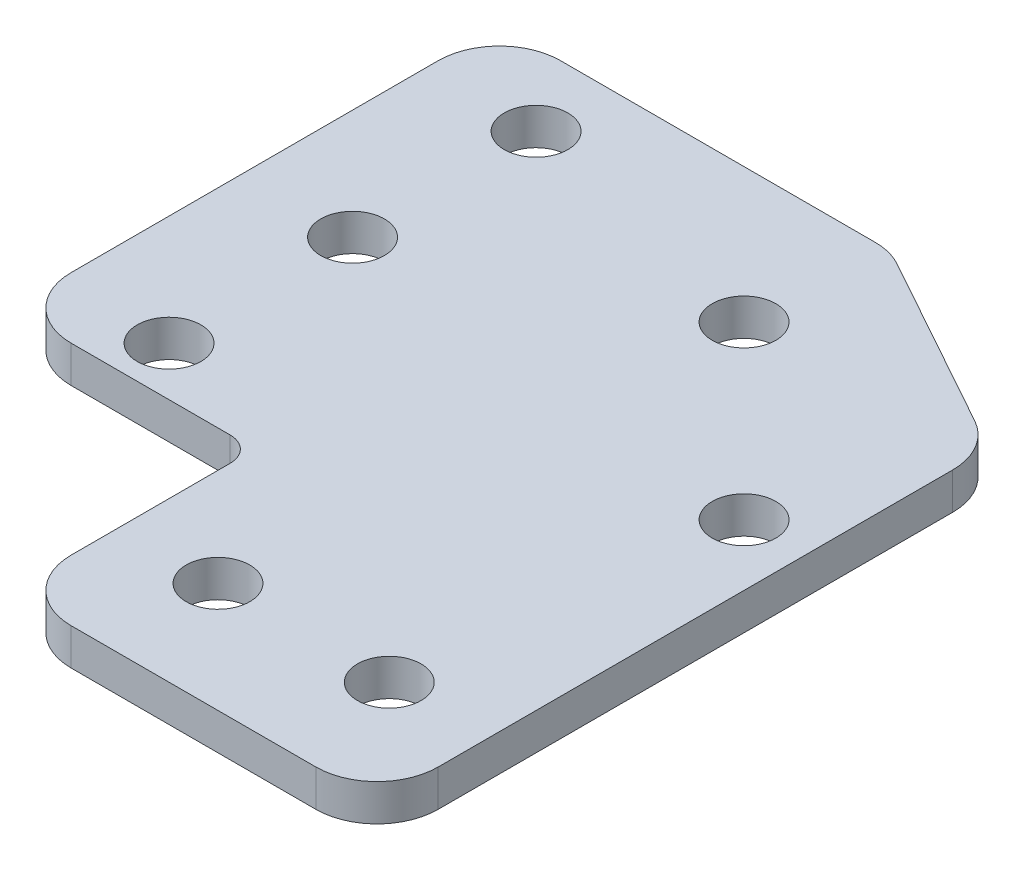
ISO-10303-21;
HEADER;
FILE_DESCRIPTION(('STEP AP214'),'2;1');
FILE_NAME('part.step','',(''),(''),'','','');
FILE_SCHEMA(('AUTOMOTIVE_DESIGN { 1 0 10303 214 1 1 1 1 }'));
ENDSEC;
DATA;
#1=APPLICATION_CONTEXT('core data for automotive mechanical design processes');
#2=APPLICATION_PROTOCOL_DEFINITION('international standard','automotive_design',2000,#1);
#3=PRODUCT_CONTEXT('',#1,'mechanical');
#4=PRODUCT('Part','Part','',(#3));
#5=PRODUCT_RELATED_PRODUCT_CATEGORY('part','',(#4));
#6=PRODUCT_DEFINITION_FORMATION('','',#4);
#7=PRODUCT_DEFINITION_CONTEXT('part definition',#1,'design');
#8=PRODUCT_DEFINITION('design','',#6,#7);
#9=PRODUCT_DEFINITION_SHAPE('','',#8);
#10=(LENGTH_UNIT() NAMED_UNIT(*) SI_UNIT(.MILLI.,.METRE.));
#11=(NAMED_UNIT(*) PLANE_ANGLE_UNIT() SI_UNIT($,.RADIAN.));
#12=(NAMED_UNIT(*) SI_UNIT($,.STERADIAN.) SOLID_ANGLE_UNIT());
#13=UNCERTAINTY_MEASURE_WITH_UNIT(LENGTH_MEASURE(1.E-05),#10,'distance_accuracy_value','');
#14=(GEOMETRIC_REPRESENTATION_CONTEXT(3) GLOBAL_UNCERTAINTY_ASSIGNED_CONTEXT((#13)) GLOBAL_UNIT_ASSIGNED_CONTEXT((#10,
#11,#12)) REPRESENTATION_CONTEXT('',''));
#15=CARTESIAN_POINT('',(0.,0.,0.));
#16=DIRECTION('',(0.,0.,1.));
#17=DIRECTION('',(1.,0.,0.));
#18=AXIS2_PLACEMENT_3D('',#15,#16,#17);
#19=CARTESIAN_POINT('',(20.,-3.,0.));
#20=DIRECTION('',(-1.,0.,0.));
#21=DIRECTION('',(0.,0.,1.));
#22=AXIS2_PLACEMENT_3D('',#19,#20,#21);
#23=PLANE('',#22);
#24=DIRECTION('',(0.,0.,1.));
#25=VECTOR('',#24,1.);
#26=CARTESIAN_POINT('',(20.,0.,0.));
#27=LINE('',#26,#25);
#28=CARTESIAN_POINT('',(20.,0.,-18.));
#29=VERTEX_POINT('',#28);
#30=CARTESIAN_POINT('',(20.,0.,-5.));
#31=VERTEX_POINT('',#30);
#32=EDGE_CURVE('E136',#29,#31,#27,.T.);
#33=ORIENTED_EDGE('',*,*,#32,.F.);
#34=DIRECTION('',(0.,1.,0.));
#35=VECTOR('',#34,1.);
#36=CARTESIAN_POINT('',(20.,-3.,-18.));
#37=LINE('',#36,#35);
#38=CARTESIAN_POINT('',(20.,-3.,-18.));
#39=VERTEX_POINT('',#38);
#40=EDGE_CURVE('E61',#29,#39,#37,.F.);
#41=ORIENTED_EDGE('',*,*,#40,.T.);
#42=DIRECTION('',(0.,0.,1.));
#43=VECTOR('',#42,1.);
#44=CARTESIAN_POINT('',(20.,-3.,0.));
#45=LINE('',#44,#43);
#46=CARTESIAN_POINT('',(20.,-3.,-5.));
#47=VERTEX_POINT('',#46);
#48=EDGE_CURVE('E156',#39,#47,#45,.T.);
#49=ORIENTED_EDGE('',*,*,#48,.T.);
#50=DIRECTION('',(0.,1.,0.));
#51=VECTOR('',#50,1.);
#52=CARTESIAN_POINT('',(20.,-3.,-5.));
#53=LINE('',#52,#51);
#54=EDGE_CURVE('E151',#47,#31,#53,.T.);
#55=ORIENTED_EDGE('',*,*,#54,.T.);
#56=EDGE_LOOP('',(#33,#41,#49,#55));
#57=FACE_BOUND('',#56,.T.);
#58=ADVANCED_FACE('F40',(#57),#23,.T.);
#59=CARTESIAN_POINT('',(20.,-3.,-20.));
#60=DIRECTION('',(0.,0.,1.));
#61=DIRECTION('',(1.,0.,0.));
#62=AXIS2_PLACEMENT_3D('',#59,#60,#61);
#63=PLANE('',#62);
#64=DIRECTION('',(1.,0.,0.));
#65=VECTOR('',#64,1.);
#66=CARTESIAN_POINT('',(20.,-3.,-20.));
#67=LINE('',#66,#65);
#68=CARTESIAN_POINT('',(5.,-3.,-20.));
#69=VERTEX_POINT('',#68);
#70=CARTESIAN_POINT('',(18.,-3.,-20.));
#71=VERTEX_POINT('',#70);
#72=EDGE_CURVE('E159',#69,#71,#67,.T.);
#73=ORIENTED_EDGE('',*,*,#72,.T.);
#74=DIRECTION('',(0.,1.,0.));
#75=VECTOR('',#74,1.);
#76=CARTESIAN_POINT('',(18.,0.,-20.));
#77=LINE('',#76,#75);
#78=CARTESIAN_POINT('',(18.,0.,-20.));
#79=VERTEX_POINT('',#78);
#80=EDGE_CURVE('E213',#71,#79,#77,.T.);
#81=ORIENTED_EDGE('',*,*,#80,.T.);
#82=DIRECTION('',(1.,0.,0.));
#83=VECTOR('',#82,1.);
#84=CARTESIAN_POINT('',(20.,0.,-20.));
#85=LINE('',#84,#83);
#86=CARTESIAN_POINT('',(5.,0.,-20.));
#87=VERTEX_POINT('',#86);
#88=EDGE_CURVE('E167',#87,#79,#85,.T.);
#89=ORIENTED_EDGE('',*,*,#88,.F.);
#90=DIRECTION('',(0.,1.,0.));
#91=VECTOR('',#90,1.);
#92=CARTESIAN_POINT('',(5.,-3.,-20.));
#93=LINE('',#92,#91);
#94=EDGE_CURVE('E196',#87,#69,#93,.F.);
#95=ORIENTED_EDGE('',*,*,#94,.T.);
#96=EDGE_LOOP('',(#73,#81,#89,#95));
#97=FACE_BOUND('',#96,.T.);
#98=ADVANCED_FACE('F219',(#97),#63,.T.);
#99=CARTESIAN_POINT('',(0.,-3.,-20.));
#100=DIRECTION('',(-1.,0.,0.));
#101=DIRECTION('',(0.,0.,1.));
#102=AXIS2_PLACEMENT_3D('',#99,#100,#101);
#103=PLANE('',#102);
#104=DIRECTION('',(0.,0.,1.));
#105=VECTOR('',#104,1.);
#106=CARTESIAN_POINT('',(0.,-3.,-20.));
#107=LINE('',#106,#105);
#108=CARTESIAN_POINT('',(0.,-3.,-55.));
#109=VERTEX_POINT('',#108);
#110=CARTESIAN_POINT('',(0.,-3.,-25.));
#111=VERTEX_POINT('',#110);
#112=EDGE_CURVE('E164',#109,#111,#107,.T.);
#113=ORIENTED_EDGE('',*,*,#112,.T.);
#114=DIRECTION('',(0.,1.,0.));
#115=VECTOR('',#114,1.);
#116=CARTESIAN_POINT('',(0.,-3.,-25.));
#117=LINE('',#116,#115);
#118=CARTESIAN_POINT('',(0.,0.,-25.));
#119=VERTEX_POINT('',#118);
#120=EDGE_CURVE('E193',#111,#119,#117,.T.);
#121=ORIENTED_EDGE('',*,*,#120,.T.);
#122=DIRECTION('',(0.,0.,1.));
#123=VECTOR('',#122,1.);
#124=CARTESIAN_POINT('',(0.,0.,-20.));
#125=LINE('',#124,#123);
#126=CARTESIAN_POINT('',(0.,0.,-55.));
#127=VERTEX_POINT('',#126);
#128=EDGE_CURVE('E225',#127,#119,#125,.T.);
#129=ORIENTED_EDGE('',*,*,#128,.F.);
#130=DIRECTION('',(0.,1.,0.));
#131=VECTOR('',#130,1.);
#132=CARTESIAN_POINT('',(0.,-3.,-55.));
#133=LINE('',#132,#131);
#134=EDGE_CURVE('E191',#127,#109,#133,.F.);
#135=ORIENTED_EDGE('',*,*,#134,.T.);
#136=EDGE_LOOP('',(#113,#121,#129,#135));
#137=FACE_BOUND('',#136,.T.);
#138=ADVANCED_FACE('F332',(#137),#103,.T.);
#139=CARTESIAN_POINT('',(0.,-3.,-60.));
#140=DIRECTION('',(0.,0.,-1.));
#141=DIRECTION('',(-1.,0.,0.));
#142=AXIS2_PLACEMENT_3D('',#139,#140,#141);
#143=PLANE('',#142);
#144=DIRECTION('',(-1.,0.,0.));
#145=VECTOR('',#144,1.);
#146=CARTESIAN_POINT('',(0.,-3.,-60.));
#147=LINE('',#146,#145);
#148=CARTESIAN_POINT('',(30.704369859013,-3.,-60.));
#149=VERTEX_POINT('',#148);
#150=CARTESIAN_POINT('',(5.,-3.,-60.));
#151=VERTEX_POINT('',#150);
#152=EDGE_CURVE('E242',#149,#151,#147,.T.);
#153=ORIENTED_EDGE('',*,*,#152,.T.);
#154=DIRECTION('',(0.,1.,0.));
#155=VECTOR('',#154,1.);
#156=CARTESIAN_POINT('',(5.,-3.,-60.));
#157=LINE('',#156,#155);
#158=CARTESIAN_POINT('',(5.,0.,-60.));
#159=VERTEX_POINT('',#158);
#160=EDGE_CURVE('E200',#151,#159,#157,.T.);
#161=ORIENTED_EDGE('',*,*,#160,.T.);
#162=DIRECTION('',(-1.,0.,0.));
#163=VECTOR('',#162,1.);
#164=CARTESIAN_POINT('',(0.,0.,-60.));
#165=LINE('',#164,#163);
#166=CARTESIAN_POINT('',(30.704369859013,0.,-60.));
#167=VERTEX_POINT('',#166);
#168=EDGE_CURVE('E228',#167,#159,#165,.T.);
#169=ORIENTED_EDGE('',*,*,#168,.F.);
#170=DIRECTION('',(0.,1.,0.));
#171=VECTOR('',#170,1.);
#172=CARTESIAN_POINT('',(30.704369859013,-3.,-60.));
#173=LINE('',#172,#171);
#174=EDGE_CURVE('E198',#167,#149,#173,.F.);
#175=ORIENTED_EDGE('',*,*,#174,.T.);
#176=EDGE_LOOP('',(#153,#161,#169,#175));
#177=FACE_BOUND('',#176,.T.);
#178=ADVANCED_FACE('F387',(#177),#143,.T.);
#179=CARTESIAN_POINT('',(32.,-3.,-60.));
#180=DIRECTION('',(0.485642931178631,0.,-0.874157276121538));
#181=DIRECTION('',(-0.874157276121538,0.,-0.485642931178631));
#182=AXIS2_PLACEMENT_3D('',#179,#180,#181);
#183=PLANE('',#182);
#184=DIRECTION('',(-0.874157276121538,0.,-0.485642931178631));
#185=VECTOR('',#184,1.);
#186=CARTESIAN_POINT('',(32.,-3.,-60.));
#187=LINE('',#186,#185);
#188=CARTESIAN_POINT('',(47.4282146558932,-3.,-51.4287696356149));
#189=VERTEX_POINT('',#188);
#190=CARTESIAN_POINT('',(33.1325845149061,-3.,-59.3707863806077));
#191=VERTEX_POINT('',#190);
#192=EDGE_CURVE('E245',#189,#191,#187,.T.);
#193=ORIENTED_EDGE('',*,*,#192,.T.);
#194=DIRECTION('',(0.,1.,0.));
#195=VECTOR('',#194,1.);
#196=CARTESIAN_POINT('',(33.1325845149061,-3.,-59.3707863806077));
#197=LINE('',#196,#195);
#198=CARTESIAN_POINT('',(33.1325845149061,0.,-59.3707863806077));
#199=VERTEX_POINT('',#198);
#200=EDGE_CURVE('E205',#191,#199,#197,.T.);
#201=ORIENTED_EDGE('',*,*,#200,.T.);
#202=DIRECTION('',(-0.874157276121538,0.,-0.485642931178631));
#203=VECTOR('',#202,1.);
#204=CARTESIAN_POINT('',(32.,0.,-60.));
#205=LINE('',#204,#203);
#206=CARTESIAN_POINT('',(47.4282146558932,0.,-51.4287696356149));
#207=VERTEX_POINT('',#206);
#208=EDGE_CURVE('E231',#207,#199,#205,.T.);
#209=ORIENTED_EDGE('',*,*,#208,.F.);
#210=DIRECTION('',(0.,1.,0.));
#211=VECTOR('',#210,1.);
#212=CARTESIAN_POINT('',(47.4282146558932,-3.,-51.4287696356149));
#213=LINE('',#212,#211);
#214=EDGE_CURVE('E203',#207,#189,#213,.F.);
#215=ORIENTED_EDGE('',*,*,#214,.T.);
#216=EDGE_LOOP('',(#193,#201,#209,#215));
#217=FACE_BOUND('',#216,.T.);
#218=ADVANCED_FACE('F380',(#217),#183,.T.);
#219=CARTESIAN_POINT('',(50.,-3.,-50.));
#220=DIRECTION('',(1.,0.,0.));
#221=DIRECTION('',(0.,0.,-1.));
#222=AXIS2_PLACEMENT_3D('',#219,#220,#221);
#223=PLANE('',#222);
#224=DIRECTION('',(0.,0.,-1.));
#225=VECTOR('',#224,1.);
#226=CARTESIAN_POINT('',(50.,-3.,-50.));
#227=LINE('',#226,#225);
#228=CARTESIAN_POINT('',(50.,-3.,-5.00000000000001));
#229=VERTEX_POINT('',#228);
#230=CARTESIAN_POINT('',(50.,-3.,-47.0579832550072));
#231=VERTEX_POINT('',#230);
#232=EDGE_CURVE('E248',#229,#231,#227,.T.);
#233=ORIENTED_EDGE('',*,*,#232,.T.);
#234=DIRECTION('',(0.,1.,0.));
#235=VECTOR('',#234,1.);
#236=CARTESIAN_POINT('',(50.,-3.,-47.0579832550072));
#237=LINE('',#236,#235);
#238=CARTESIAN_POINT('',(50.,0.,-47.0579832550072));
#239=VERTEX_POINT('',#238);
#240=EDGE_CURVE('E210',#231,#239,#237,.T.);
#241=ORIENTED_EDGE('',*,*,#240,.T.);
#242=DIRECTION('',(0.,0.,-1.));
#243=VECTOR('',#242,1.);
#244=CARTESIAN_POINT('',(50.,0.,-50.));
#245=LINE('',#244,#243);
#246=CARTESIAN_POINT('',(50.,0.,-5.00000000000001));
#247=VERTEX_POINT('',#246);
#248=EDGE_CURVE('E236',#247,#239,#245,.T.);
#249=ORIENTED_EDGE('',*,*,#248,.F.);
#250=DIRECTION('',(0.,1.,0.));
#251=VECTOR('',#250,1.);
#252=CARTESIAN_POINT('',(50.,-3.,-5.00000000000001));
#253=LINE('',#252,#251);
#254=EDGE_CURVE('E208',#247,#229,#253,.F.);
#255=ORIENTED_EDGE('',*,*,#254,.T.);
#256=EDGE_LOOP('',(#233,#241,#249,#255));
#257=FACE_BOUND('',#256,.T.);
#258=ADVANCED_FACE('F374',(#257),#223,.T.);
#259=CARTESIAN_POINT('',(50.,-3.,0.));
#260=DIRECTION('',(0.,0.,1.));
#261=DIRECTION('',(1.,0.,0.));
#262=AXIS2_PLACEMENT_3D('',#259,#260,#261);
#263=PLANE('',#262);
#264=DIRECTION('',(1.,0.,0.));
#265=VECTOR('',#264,1.);
#266=CARTESIAN_POINT('',(50.,0.,0.));
#267=LINE('',#266,#265);
#268=CARTESIAN_POINT('',(25.,0.,0.));
#269=VERTEX_POINT('',#268);
#270=CARTESIAN_POINT('',(45.,0.,0.));
#271=VERTEX_POINT('',#270);
#272=EDGE_CURVE('E143',#269,#271,#267,.T.);
#273=ORIENTED_EDGE('',*,*,#272,.F.);
#274=DIRECTION('',(0.,1.,0.));
#275=VECTOR('',#274,1.);
#276=CARTESIAN_POINT('',(25.,-3.,0.));
#277=LINE('',#276,#275);
#278=CARTESIAN_POINT('',(25.,-3.,0.));
#279=VERTEX_POINT('',#278);
#280=EDGE_CURVE('E152',#269,#279,#277,.F.);
#281=ORIENTED_EDGE('',*,*,#280,.T.);
#282=DIRECTION('',(1.,0.,0.));
#283=VECTOR('',#282,1.);
#284=CARTESIAN_POINT('',(50.,-3.,0.));
#285=LINE('',#284,#283);
#286=CARTESIAN_POINT('',(45.,-3.,0.));
#287=VERTEX_POINT('',#286);
#288=EDGE_CURVE('E226',#279,#287,#285,.T.);
#289=ORIENTED_EDGE('',*,*,#288,.T.);
#290=DIRECTION('',(0.,1.,0.));
#291=VECTOR('',#290,1.);
#292=CARTESIAN_POINT('',(45.,-3.,0.));
#293=LINE('',#292,#291);
#294=EDGE_CURVE('E153',#287,#271,#293,.T.);
#295=ORIENTED_EDGE('',*,*,#294,.T.);
#296=EDGE_LOOP('',(#273,#281,#289,#295));
#297=FACE_BOUND('',#296,.T.);
#298=ADVANCED_FACE('F336',(#297),#263,.T.);
#299=CARTESIAN_POINT('',(0.,-3.,0.));
#300=DIRECTION('',(0.,1.,0.));
#301=DIRECTION('',(0.,0.,1.));
#302=AXIS2_PLACEMENT_3D('',#299,#300,#301);
#303=PLANE('',#302);
#304=CARTESIAN_POINT('',(45.,-3.,-35.));
#305=DIRECTION('',(0.,1.,0.));
#306=DIRECTION('',(0.,0.,1.));
#307=AXIS2_PLACEMENT_3D('',#304,#305,#306);
#308=CIRCLE('',#307,2.6);
#309=CARTESIAN_POINT('',(45.,-3.,-32.4));
#310=VERTEX_POINT('',#309);
#311=EDGE_CURVE('E280',#310,#310,#308,.T.);
#312=ORIENTED_EDGE('',*,*,#311,.T.);
#313=EDGE_LOOP('',(#312));
#314=FACE_BOUND('',#313,.T.);
#315=CARTESIAN_POINT('',(31.,-3.,-49.));
#316=DIRECTION('',(0.,1.,0.));
#317=DIRECTION('',(0.,0.,1.));
#318=AXIS2_PLACEMENT_3D('',#315,#316,#317);
#319=CIRCLE('',#318,2.6);
#320=CARTESIAN_POINT('',(31.,-3.,-46.4));
#321=VERTEX_POINT('',#320);
#322=EDGE_CURVE('E285',#321,#321,#319,.T.);
#323=ORIENTED_EDGE('',*,*,#322,.T.);
#324=EDGE_LOOP('',(#323));
#325=FACE_BOUND('',#324,.T.);
#326=CARTESIAN_POINT('',(8.99999999999999,-3.,-54.));
#327=DIRECTION('',(0.,1.,0.));
#328=DIRECTION('',(0.,0.,1.));
#329=AXIS2_PLACEMENT_3D('',#326,#327,#328);
#330=CIRCLE('',#329,2.6);
#331=CARTESIAN_POINT('',(8.99999999999999,-3.,-51.4));
#332=VERTEX_POINT('',#331);
#333=EDGE_CURVE('E274',#332,#332,#330,.T.);
#334=ORIENTED_EDGE('',*,*,#333,.T.);
#335=EDGE_LOOP('',(#334));
#336=FACE_BOUND('',#335,.T.);
#337=CARTESIAN_POINT('',(42.,-3.,-9.));
#338=DIRECTION('',(0.,1.,0.));
#339=DIRECTION('',(0.,0.,1.));
#340=AXIS2_PLACEMENT_3D('',#337,#338,#339);
#341=CIRCLE('',#340,2.6);
#342=CARTESIAN_POINT('',(42.,-3.,-6.4));
#343=VERTEX_POINT('',#342);
#344=EDGE_CURVE('E268',#343,#343,#341,.T.);
#345=ORIENTED_EDGE('',*,*,#344,.T.);
#346=EDGE_LOOP('',(#345));
#347=FACE_BOUND('',#346,.T.);
#348=CARTESIAN_POINT('',(28.,-3.,-8.99999999999999));
#349=DIRECTION('',(0.,1.,0.));
#350=DIRECTION('',(0.,0.,1.));
#351=AXIS2_PLACEMENT_3D('',#348,#349,#350);
#352=CIRCLE('',#351,2.59999999999999);
#353=CARTESIAN_POINT('',(28.,-3.,-6.4));
#354=VERTEX_POINT('',#353);
#355=EDGE_CURVE('E262',#354,#354,#352,.T.);
#356=ORIENTED_EDGE('',*,*,#355,.T.);
#357=EDGE_LOOP('',(#356));
#358=FACE_BOUND('',#357,.T.);
#359=CARTESIAN_POINT('',(9.,-3.,-24.));
#360=DIRECTION('',(0.,1.,0.));
#361=DIRECTION('',(0.,0.,1.));
#362=AXIS2_PLACEMENT_3D('',#359,#360,#361);
#363=CIRCLE('',#362,2.6);
#364=CARTESIAN_POINT('',(9.,-3.,-21.4));
#365=VERTEX_POINT('',#364);
#366=EDGE_CURVE('E256',#365,#365,#363,.T.);
#367=ORIENTED_EDGE('',*,*,#366,.T.);
#368=EDGE_LOOP('',(#367));
#369=FACE_BOUND('',#368,.T.);
#370=CARTESIAN_POINT('',(9.,-3.,-39.));
#371=DIRECTION('',(0.,1.,0.));
#372=DIRECTION('',(0.,0.,1.));
#373=AXIS2_PLACEMENT_3D('',#370,#371,#372);
#374=CIRCLE('',#373,2.59999999999999);
#375=CARTESIAN_POINT('',(9.,-3.,-36.4));
#376=VERTEX_POINT('',#375);
#377=EDGE_CURVE('E144',#376,#376,#374,.T.);
#378=ORIENTED_EDGE('',*,*,#377,.T.);
#379=EDGE_LOOP('',(#378));
#380=FACE_BOUND('',#379,.T.);
#381=ORIENTED_EDGE('',*,*,#288,.F.);
#382=CARTESIAN_POINT('',(25.,-3.,-5.));
#383=DIRECTION('',(0.,1.,0.));
#384=DIRECTION('',(0.,0.,1.));
#385=AXIS2_PLACEMENT_3D('',#382,#383,#384);
#386=CIRCLE('',#385,5.);
#387=EDGE_CURVE('E189',#279,#47,#386,.F.);
#388=ORIENTED_EDGE('',*,*,#387,.T.);
#389=ORIENTED_EDGE('',*,*,#48,.F.);
#390=CARTESIAN_POINT('',(18.,-3.,-18.));
#391=DIRECTION('',(0.,1.,0.));
#392=DIRECTION('',(0.,0.,1.));
#393=AXIS2_PLACEMENT_3D('',#390,#391,#392);
#394=CIRCLE('',#393,2.);
#395=EDGE_CURVE('E11',#39,#71,#394,.T.);
#396=ORIENTED_EDGE('',*,*,#395,.T.);
#397=ORIENTED_EDGE('',*,*,#72,.F.);
#398=CARTESIAN_POINT('',(5.,-3.,-25.));
#399=DIRECTION('',(0.,1.,0.));
#400=DIRECTION('',(0.,0.,1.));
#401=AXIS2_PLACEMENT_3D('',#398,#399,#400);
#402=CIRCLE('',#401,5.);
#403=EDGE_CURVE('E187',#69,#111,#402,.F.);
#404=ORIENTED_EDGE('',*,*,#403,.T.);
#405=ORIENTED_EDGE('',*,*,#112,.F.);
#406=CARTESIAN_POINT('',(5.,-3.,-55.));
#407=DIRECTION('',(0.,1.,0.));
#408=DIRECTION('',(0.,0.,1.));
#409=AXIS2_PLACEMENT_3D('',#406,#407,#408);
#410=CIRCLE('',#409,5.);
#411=EDGE_CURVE('E185',#109,#151,#410,.F.);
#412=ORIENTED_EDGE('',*,*,#411,.T.);
#413=ORIENTED_EDGE('',*,*,#152,.F.);
#414=CARTESIAN_POINT('',(30.704369859013,-3.,-55.));
#415=DIRECTION('',(0.,1.,0.));
#416=DIRECTION('',(0.,0.,1.));
#417=AXIS2_PLACEMENT_3D('',#414,#415,#416);
#418=CIRCLE('',#417,5.);
#419=EDGE_CURVE('E183',#149,#191,#418,.F.);
#420=ORIENTED_EDGE('',*,*,#419,.T.);
#421=ORIENTED_EDGE('',*,*,#192,.F.);
#422=CARTESIAN_POINT('',(45.,-3.,-47.0579832550072));
#423=DIRECTION('',(0.,1.,0.));
#424=DIRECTION('',(0.,0.,1.));
#425=AXIS2_PLACEMENT_3D('',#422,#423,#424);
#426=CIRCLE('',#425,5.);
#427=EDGE_CURVE('E181',#189,#231,#426,.F.);
#428=ORIENTED_EDGE('',*,*,#427,.T.);
#429=ORIENTED_EDGE('',*,*,#232,.F.);
#430=CARTESIAN_POINT('',(45.,-3.,-5.00000000000001));
#431=DIRECTION('',(0.,1.,0.));
#432=DIRECTION('',(0.,0.,1.));
#433=AXIS2_PLACEMENT_3D('',#430,#431,#432);
#434=CIRCLE('',#433,5.);
#435=EDGE_CURVE('E179',#229,#287,#434,.F.);
#436=ORIENTED_EDGE('',*,*,#435,.T.);
#437=EDGE_LOOP('',(#381,#388,#389,#396,#397,#404,#405,#412,#413,#420,#421,#428,#429,#436));
#438=FACE_BOUND('',#437,.T.);
#439=ADVANCED_FACE('F301',(#314,#325,#336,#347,#358,#369,#380,#438),#303,.F.);
#440=CARTESIAN_POINT('',(0.,0.,0.));
#441=DIRECTION('',(0.,1.,0.));
#442=DIRECTION('',(0.,0.,1.));
#443=AXIS2_PLACEMENT_3D('',#440,#441,#442);
#444=PLANE('',#443);
#445=CARTESIAN_POINT('',(45.,0.,-35.));
#446=DIRECTION('',(0.,1.,0.));
#447=DIRECTION('',(0.,0.,1.));
#448=AXIS2_PLACEMENT_3D('',#445,#446,#447);
#449=CIRCLE('',#448,2.6);
#450=CARTESIAN_POINT('',(45.,0.,-32.4));
#451=VERTEX_POINT('',#450);
#452=EDGE_CURVE('E288',#451,#451,#449,.T.);
#453=ORIENTED_EDGE('',*,*,#452,.F.);
#454=EDGE_LOOP('',(#453));
#455=FACE_BOUND('',#454,.T.);
#456=CARTESIAN_POINT('',(31.,0.,-49.));
#457=DIRECTION('',(0.,1.,0.));
#458=DIRECTION('',(0.,0.,1.));
#459=AXIS2_PLACEMENT_3D('',#456,#457,#458);
#460=CIRCLE('',#459,2.6);
#461=CARTESIAN_POINT('',(31.,0.,-46.4));
#462=VERTEX_POINT('',#461);
#463=EDGE_CURVE('E289',#462,#462,#460,.T.);
#464=ORIENTED_EDGE('',*,*,#463,.F.);
#465=EDGE_LOOP('',(#464));
#466=FACE_BOUND('',#465,.T.);
#467=CARTESIAN_POINT('',(8.99999999999999,0.,-54.));
#468=DIRECTION('',(0.,1.,0.));
#469=DIRECTION('',(0.,0.,1.));
#470=AXIS2_PLACEMENT_3D('',#467,#468,#469);
#471=CIRCLE('',#470,2.6);
#472=CARTESIAN_POINT('',(8.99999999999999,0.,-51.4));
#473=VERTEX_POINT('',#472);
#474=EDGE_CURVE('E277',#473,#473,#471,.T.);
#475=ORIENTED_EDGE('',*,*,#474,.F.);
#476=EDGE_LOOP('',(#475));
#477=FACE_BOUND('',#476,.T.);
#478=CARTESIAN_POINT('',(42.,0.,-9.));
#479=DIRECTION('',(0.,1.,0.));
#480=DIRECTION('',(0.,0.,1.));
#481=AXIS2_PLACEMENT_3D('',#478,#479,#480);
#482=CIRCLE('',#481,2.6);
#483=CARTESIAN_POINT('',(42.,0.,-6.4));
#484=VERTEX_POINT('',#483);
#485=EDGE_CURVE('E271',#484,#484,#482,.T.);
#486=ORIENTED_EDGE('',*,*,#485,.F.);
#487=EDGE_LOOP('',(#486));
#488=FACE_BOUND('',#487,.T.);
#489=CARTESIAN_POINT('',(28.,0.,-8.99999999999999));
#490=DIRECTION('',(0.,1.,0.));
#491=DIRECTION('',(0.,0.,1.));
#492=AXIS2_PLACEMENT_3D('',#489,#490,#491);
#493=CIRCLE('',#492,2.59999999999999);
#494=CARTESIAN_POINT('',(28.,0.,-6.4));
#495=VERTEX_POINT('',#494);
#496=EDGE_CURVE('E265',#495,#495,#493,.T.);
#497=ORIENTED_EDGE('',*,*,#496,.F.);
#498=EDGE_LOOP('',(#497));
#499=FACE_BOUND('',#498,.T.);
#500=CARTESIAN_POINT('',(9.,0.,-24.));
#501=DIRECTION('',(0.,1.,0.));
#502=DIRECTION('',(0.,0.,1.));
#503=AXIS2_PLACEMENT_3D('',#500,#501,#502);
#504=CIRCLE('',#503,2.6);
#505=CARTESIAN_POINT('',(9.,0.,-21.4));
#506=VERTEX_POINT('',#505);
#507=EDGE_CURVE('E259',#506,#506,#504,.T.);
#508=ORIENTED_EDGE('',*,*,#507,.F.);
#509=EDGE_LOOP('',(#508));
#510=FACE_BOUND('',#509,.T.);
#511=CARTESIAN_POINT('',(9.,0.,-39.));
#512=DIRECTION('',(0.,1.,0.));
#513=DIRECTION('',(0.,0.,1.));
#514=AXIS2_PLACEMENT_3D('',#511,#512,#513);
#515=CIRCLE('',#514,2.59999999999999);
#516=CARTESIAN_POINT('',(9.,0.,-36.4));
#517=VERTEX_POINT('',#516);
#518=EDGE_CURVE('E253',#517,#517,#515,.T.);
#519=ORIENTED_EDGE('',*,*,#518,.F.);
#520=EDGE_LOOP('',(#519));
#521=FACE_BOUND('',#520,.T.);
#522=ORIENTED_EDGE('',*,*,#88,.T.);
#523=CARTESIAN_POINT('',(18.,0.,-18.));
#524=DIRECTION('',(0.,1.,0.));
#525=DIRECTION('',(0.,0.,1.));
#526=AXIS2_PLACEMENT_3D('',#523,#524,#525);
#527=CIRCLE('',#526,2.);
#528=EDGE_CURVE('E48',#79,#29,#527,.F.);
#529=ORIENTED_EDGE('',*,*,#528,.T.);
#530=ORIENTED_EDGE('',*,*,#32,.T.);
#531=CARTESIAN_POINT('',(25.,0.,-5.));
#532=DIRECTION('',(0.,1.,0.));
#533=DIRECTION('',(0.,0.,1.));
#534=AXIS2_PLACEMENT_3D('',#531,#532,#533);
#535=CIRCLE('',#534,5.);
#536=EDGE_CURVE('E140',#31,#269,#535,.T.);
#537=ORIENTED_EDGE('',*,*,#536,.T.);
#538=ORIENTED_EDGE('',*,*,#272,.T.);
#539=CARTESIAN_POINT('',(45.,0.,-5.00000000000001));
#540=DIRECTION('',(0.,1.,0.));
#541=DIRECTION('',(0.,0.,1.));
#542=AXIS2_PLACEMENT_3D('',#539,#540,#541);
#543=CIRCLE('',#542,5.);
#544=EDGE_CURVE('E158',#271,#247,#543,.T.);
#545=ORIENTED_EDGE('',*,*,#544,.T.);
#546=ORIENTED_EDGE('',*,*,#248,.T.);
#547=CARTESIAN_POINT('',(45.,0.,-47.0579832550072));
#548=DIRECTION('',(0.,1.,0.));
#549=DIRECTION('',(0.,0.,1.));
#550=AXIS2_PLACEMENT_3D('',#547,#548,#549);
#551=CIRCLE('',#550,5.);
#552=EDGE_CURVE('E161',#239,#207,#551,.T.);
#553=ORIENTED_EDGE('',*,*,#552,.T.);
#554=ORIENTED_EDGE('',*,*,#208,.T.);
#555=CARTESIAN_POINT('',(30.704369859013,0.,-55.));
#556=DIRECTION('',(0.,1.,0.));
#557=DIRECTION('',(0.,0.,1.));
#558=AXIS2_PLACEMENT_3D('',#555,#556,#557);
#559=CIRCLE('',#558,5.);
#560=EDGE_CURVE('E171',#199,#167,#559,.T.);
#561=ORIENTED_EDGE('',*,*,#560,.T.);
#562=ORIENTED_EDGE('',*,*,#168,.T.);
#563=CARTESIAN_POINT('',(5.,0.,-55.));
#564=DIRECTION('',(0.,1.,0.));
#565=DIRECTION('',(0.,0.,1.));
#566=AXIS2_PLACEMENT_3D('',#563,#564,#565);
#567=CIRCLE('',#566,5.);
#568=EDGE_CURVE('E173',#159,#127,#567,.T.);
#569=ORIENTED_EDGE('',*,*,#568,.T.);
#570=ORIENTED_EDGE('',*,*,#128,.T.);
#571=CARTESIAN_POINT('',(5.,0.,-25.));
#572=DIRECTION('',(0.,1.,0.));
#573=DIRECTION('',(0.,0.,1.));
#574=AXIS2_PLACEMENT_3D('',#571,#572,#573);
#575=CIRCLE('',#574,5.);
#576=EDGE_CURVE('E154',#119,#87,#575,.T.);
#577=ORIENTED_EDGE('',*,*,#576,.T.);
#578=EDGE_LOOP('',(#522,#529,#530,#537,#538,#545,#546,#553,#554,#561,#562,#569,#570,#577));
#579=FACE_BOUND('',#578,.T.);
#580=ADVANCED_FACE('F138',(#455,#466,#477,#488,#499,#510,#521,#579),#444,.T.);
#581=CARTESIAN_POINT('',(9.,-3.,-39.));
#582=DIRECTION('',(0.,1.,0.));
#583=DIRECTION('',(0.,0.,1.));
#584=AXIS2_PLACEMENT_3D('',#581,#582,#583);
#585=CYLINDRICAL_SURFACE('',#584,2.59999999999999);
#586=ORIENTED_EDGE('',*,*,#377,.F.);
#587=EDGE_LOOP('',(#586));
#588=FACE_BOUND('',#587,.T.);
#589=ORIENTED_EDGE('',*,*,#518,.T.);
#590=EDGE_LOOP('',(#589));
#591=FACE_BOUND('',#590,.T.);
#592=ADVANCED_FACE('F300',(#588,#591),#585,.F.);
#593=CARTESIAN_POINT('',(9.,-3.,-24.));
#594=DIRECTION('',(0.,1.,0.));
#595=DIRECTION('',(0.,0.,1.));
#596=AXIS2_PLACEMENT_3D('',#593,#594,#595);
#597=CYLINDRICAL_SURFACE('',#596,2.6);
#598=ORIENTED_EDGE('',*,*,#366,.F.);
#599=EDGE_LOOP('',(#598));
#600=FACE_BOUND('',#599,.T.);
#601=ORIENTED_EDGE('',*,*,#507,.T.);
#602=EDGE_LOOP('',(#601));
#603=FACE_BOUND('',#602,.T.);
#604=ADVANCED_FACE('F316',(#600,#603),#597,.F.);
#605=CARTESIAN_POINT('',(28.,-3.,-8.99999999999999));
#606=DIRECTION('',(0.,1.,0.));
#607=DIRECTION('',(0.,0.,1.));
#608=AXIS2_PLACEMENT_3D('',#605,#606,#607);
#609=CYLINDRICAL_SURFACE('',#608,2.59999999999999);
#610=ORIENTED_EDGE('',*,*,#355,.F.);
#611=EDGE_LOOP('',(#610));
#612=FACE_BOUND('',#611,.T.);
#613=ORIENTED_EDGE('',*,*,#496,.T.);
#614=EDGE_LOOP('',(#613));
#615=FACE_BOUND('',#614,.T.);
#616=ADVANCED_FACE('F322',(#612,#615),#609,.F.);
#617=CARTESIAN_POINT('',(42.,-3.,-9.));
#618=DIRECTION('',(0.,1.,0.));
#619=DIRECTION('',(0.,0.,1.));
#620=AXIS2_PLACEMENT_3D('',#617,#618,#619);
#621=CYLINDRICAL_SURFACE('',#620,2.6);
#622=ORIENTED_EDGE('',*,*,#344,.F.);
#623=EDGE_LOOP('',(#622));
#624=FACE_BOUND('',#623,.T.);
#625=ORIENTED_EDGE('',*,*,#485,.T.);
#626=EDGE_LOOP('',(#625));
#627=FACE_BOUND('',#626,.T.);
#628=ADVANCED_FACE('F406',(#624,#627),#621,.F.);
#629=CARTESIAN_POINT('',(8.99999999999999,-3.,-54.));
#630=DIRECTION('',(0.,1.,0.));
#631=DIRECTION('',(0.,0.,1.));
#632=AXIS2_PLACEMENT_3D('',#629,#630,#631);
#633=CYLINDRICAL_SURFACE('',#632,2.6);
#634=ORIENTED_EDGE('',*,*,#333,.F.);
#635=EDGE_LOOP('',(#634));
#636=FACE_BOUND('',#635,.T.);
#637=ORIENTED_EDGE('',*,*,#474,.T.);
#638=EDGE_LOOP('',(#637));
#639=FACE_BOUND('',#638,.T.);
#640=ADVANCED_FACE('F341',(#636,#639),#633,.F.);
#641=CARTESIAN_POINT('',(25.,-3.,-5.));
#642=DIRECTION('',(0.,1.,0.));
#643=DIRECTION('',(0.,0.,1.));
#644=AXIS2_PLACEMENT_3D('',#641,#642,#643);
#645=CYLINDRICAL_SURFACE('',#644,5.);
#646=ORIENTED_EDGE('',*,*,#387,.F.);
#647=ORIENTED_EDGE('',*,*,#280,.F.);
#648=ORIENTED_EDGE('',*,*,#536,.F.);
#649=ORIENTED_EDGE('',*,*,#54,.F.);
#650=EDGE_LOOP('',(#646,#647,#648,#649));
#651=FACE_BOUND('',#650,.T.);
#652=ADVANCED_FACE('F150',(#651),#645,.T.);
#653=CARTESIAN_POINT('',(5.,-3.,-25.));
#654=DIRECTION('',(0.,1.,0.));
#655=DIRECTION('',(0.,0.,1.));
#656=AXIS2_PLACEMENT_3D('',#653,#654,#655);
#657=CYLINDRICAL_SURFACE('',#656,5.);
#658=ORIENTED_EDGE('',*,*,#403,.F.);
#659=ORIENTED_EDGE('',*,*,#94,.F.);
#660=ORIENTED_EDGE('',*,*,#576,.F.);
#661=ORIENTED_EDGE('',*,*,#120,.F.);
#662=EDGE_LOOP('',(#658,#659,#660,#661));
#663=FACE_BOUND('',#662,.T.);
#664=ADVANCED_FACE('F340',(#663),#657,.T.);
#665=CARTESIAN_POINT('',(5.,-3.,-55.));
#666=DIRECTION('',(0.,1.,0.));
#667=DIRECTION('',(0.,0.,1.));
#668=AXIS2_PLACEMENT_3D('',#665,#666,#667);
#669=CYLINDRICAL_SURFACE('',#668,5.);
#670=ORIENTED_EDGE('',*,*,#411,.F.);
#671=ORIENTED_EDGE('',*,*,#134,.F.);
#672=ORIENTED_EDGE('',*,*,#568,.F.);
#673=ORIENTED_EDGE('',*,*,#160,.F.);
#674=EDGE_LOOP('',(#670,#671,#672,#673));
#675=FACE_BOUND('',#674,.T.);
#676=ADVANCED_FACE('F344',(#675),#669,.T.);
#677=CARTESIAN_POINT('',(30.704369859013,-3.,-55.));
#678=DIRECTION('',(0.,1.,0.));
#679=DIRECTION('',(0.,0.,1.));
#680=AXIS2_PLACEMENT_3D('',#677,#678,#679);
#681=CYLINDRICAL_SURFACE('',#680,5.);
#682=ORIENTED_EDGE('',*,*,#419,.F.);
#683=ORIENTED_EDGE('',*,*,#174,.F.);
#684=ORIENTED_EDGE('',*,*,#560,.F.);
#685=ORIENTED_EDGE('',*,*,#200,.F.);
#686=EDGE_LOOP('',(#682,#683,#684,#685));
#687=FACE_BOUND('',#686,.T.);
#688=ADVANCED_FACE('F348',(#687),#681,.T.);
#689=CARTESIAN_POINT('',(45.,-3.,-47.0579832550072));
#690=DIRECTION('',(0.,1.,0.));
#691=DIRECTION('',(0.,0.,1.));
#692=AXIS2_PLACEMENT_3D('',#689,#690,#691);
#693=CYLINDRICAL_SURFACE('',#692,5.);
#694=ORIENTED_EDGE('',*,*,#427,.F.);
#695=ORIENTED_EDGE('',*,*,#214,.F.);
#696=ORIENTED_EDGE('',*,*,#552,.F.);
#697=ORIENTED_EDGE('',*,*,#240,.F.);
#698=EDGE_LOOP('',(#694,#695,#696,#697));
#699=FACE_BOUND('',#698,.T.);
#700=ADVANCED_FACE('F352',(#699),#693,.T.);
#701=CARTESIAN_POINT('',(45.,-3.,-5.00000000000001));
#702=DIRECTION('',(0.,1.,0.));
#703=DIRECTION('',(0.,0.,1.));
#704=AXIS2_PLACEMENT_3D('',#701,#702,#703);
#705=CYLINDRICAL_SURFACE('',#704,5.);
#706=ORIENTED_EDGE('',*,*,#435,.F.);
#707=ORIENTED_EDGE('',*,*,#254,.F.);
#708=ORIENTED_EDGE('',*,*,#544,.F.);
#709=ORIENTED_EDGE('',*,*,#294,.F.);
#710=EDGE_LOOP('',(#706,#707,#708,#709));
#711=FACE_BOUND('',#710,.T.);
#712=ADVANCED_FACE('F355',(#711),#705,.T.);
#713=CARTESIAN_POINT('',(31.,-10.,-49.));
#714=DIRECTION('',(0.,1.,0.));
#715=DIRECTION('',(0.,0.,1.));
#716=AXIS2_PLACEMENT_3D('',#713,#714,#715);
#717=CYLINDRICAL_SURFACE('',#716,2.6);
#718=ORIENTED_EDGE('',*,*,#463,.T.);
#719=EDGE_LOOP('',(#718));
#720=FACE_BOUND('',#719,.T.);
#721=ORIENTED_EDGE('',*,*,#322,.F.);
#722=EDGE_LOOP('',(#721));
#723=FACE_BOUND('',#722,.T.);
#724=ADVANCED_FACE('F358',(#720,#723),#717,.F.);
#725=CARTESIAN_POINT('',(45.,-10.,-35.));
#726=DIRECTION('',(0.,1.,0.));
#727=DIRECTION('',(0.,0.,1.));
#728=AXIS2_PLACEMENT_3D('',#725,#726,#727);
#729=CYLINDRICAL_SURFACE('',#728,2.6);
#730=ORIENTED_EDGE('',*,*,#452,.T.);
#731=EDGE_LOOP('',(#730));
#732=FACE_BOUND('',#731,.T.);
#733=ORIENTED_EDGE('',*,*,#311,.F.);
#734=EDGE_LOOP('',(#733));
#735=FACE_BOUND('',#734,.T.);
#736=ADVANCED_FACE('F295',(#732,#735),#729,.F.);
#737=CARTESIAN_POINT('',(18.,-3.,-18.));
#738=DIRECTION('',(0.,-1.,0.));
#739=DIRECTION('',(0.,0.,-1.));
#740=AXIS2_PLACEMENT_3D('',#737,#738,#739);
#741=CYLINDRICAL_SURFACE('',#740,2.);
#742=ORIENTED_EDGE('',*,*,#395,.F.);
#743=ORIENTED_EDGE('',*,*,#40,.F.);
#744=ORIENTED_EDGE('',*,*,#528,.F.);
#745=ORIENTED_EDGE('',*,*,#80,.F.);
#746=EDGE_LOOP('',(#742,#743,#744,#745));
#747=FACE_BOUND('',#746,.T.);
#748=ADVANCED_FACE('F42',(#747),#741,.F.);
#749=CLOSED_SHELL('',(#58,#98,#138,#178,#218,#258,#298,#439,#580,#592,#604,#616,#628,#640,#652,
#664,#676,#688,#700,#712,#724,#736,#748));
#750=MANIFOLD_SOLID_BREP('B2',#749);
#751=ADVANCED_BREP_SHAPE_REPRESENTATION('',(#18,#750),#14);
#752=SHAPE_DEFINITION_REPRESENTATION(#9,#751);
ENDSEC;
END-ISO-10303-21;
